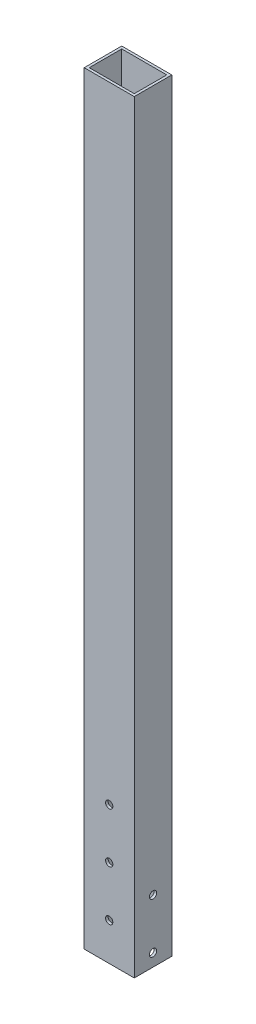
ISO-10303-21;
HEADER;
FILE_DESCRIPTION(('STEP AP214'),'2;1');
FILE_NAME('part.step','',(''),(''),'','','');
FILE_SCHEMA(('AUTOMOTIVE_DESIGN { 1 0 10303 214 1 1 1 1 }'));
ENDSEC;
DATA;
#1=APPLICATION_CONTEXT('core data for automotive mechanical design processes');
#2=APPLICATION_PROTOCOL_DEFINITION('international standard','automotive_design',2000,#1);
#3=PRODUCT_CONTEXT('',#1,'mechanical');
#4=PRODUCT('Part','Part','',(#3));
#5=PRODUCT_RELATED_PRODUCT_CATEGORY('part','',(#4));
#6=PRODUCT_DEFINITION_FORMATION('','',#4);
#7=PRODUCT_DEFINITION_CONTEXT('part definition',#1,'design');
#8=PRODUCT_DEFINITION('design','',#6,#7);
#9=PRODUCT_DEFINITION_SHAPE('','',#8);
#10=(LENGTH_UNIT() NAMED_UNIT(*) SI_UNIT(.MILLI.,.METRE.));
#11=(NAMED_UNIT(*) PLANE_ANGLE_UNIT() SI_UNIT($,.RADIAN.));
#12=(NAMED_UNIT(*) SI_UNIT($,.STERADIAN.) SOLID_ANGLE_UNIT());
#13=UNCERTAINTY_MEASURE_WITH_UNIT(LENGTH_MEASURE(1.E-05),#10,'distance_accuracy_value','');
#14=(GEOMETRIC_REPRESENTATION_CONTEXT(3) GLOBAL_UNCERTAINTY_ASSIGNED_CONTEXT((#13)) GLOBAL_UNIT_ASSIGNED_CONTEXT((#10,
#11,#12)) REPRESENTATION_CONTEXT('',''));
#15=CARTESIAN_POINT('',(0.,0.,0.));
#16=DIRECTION('',(0.,0.,1.));
#17=DIRECTION('',(1.,0.,0.));
#18=AXIS2_PLACEMENT_3D('',#15,#16,#17);
#19=CARTESIAN_POINT('',(0.,305.,0.));
#20=DIRECTION('',(0.,1.,0.));
#21=DIRECTION('',(0.,0.,1.));
#22=AXIS2_PLACEMENT_3D('',#19,#20,#21);
#23=PLANE('',#22);
#24=DIRECTION('',(0.,0.,-1.));
#25=VECTOR('',#24,1.);
#26=CARTESIAN_POINT('',(10.,305.,7.5));
#27=LINE('',#26,#25);
#28=CARTESIAN_POINT('',(10.,305.,7.5));
#29=VERTEX_POINT('',#28);
#30=CARTESIAN_POINT('',(10.,305.,-7.5));
#31=VERTEX_POINT('',#30);
#32=EDGE_CURVE('E187',#29,#31,#27,.T.);
#33=ORIENTED_EDGE('',*,*,#32,.T.);
#34=DIRECTION('',(-1.,0.,0.));
#35=VECTOR('',#34,1.);
#36=CARTESIAN_POINT('',(-10.,305.,-7.5));
#37=LINE('',#36,#35);
#38=CARTESIAN_POINT('',(-10.,305.,-7.5));
#39=VERTEX_POINT('',#38);
#40=EDGE_CURVE('E191',#31,#39,#37,.T.);
#41=ORIENTED_EDGE('',*,*,#40,.T.);
#42=DIRECTION('',(0.,0.,1.));
#43=VECTOR('',#42,1.);
#44=CARTESIAN_POINT('',(-10.,305.,7.5));
#45=LINE('',#44,#43);
#46=CARTESIAN_POINT('',(-10.,305.,7.5));
#47=VERTEX_POINT('',#46);
#48=EDGE_CURVE('E195',#39,#47,#45,.T.);
#49=ORIENTED_EDGE('',*,*,#48,.T.);
#50=DIRECTION('',(1.,0.,0.));
#51=VECTOR('',#50,1.);
#52=CARTESIAN_POINT('',(-10.,305.,7.5));
#53=LINE('',#52,#51);
#54=EDGE_CURVE('E198',#47,#29,#53,.T.);
#55=ORIENTED_EDGE('',*,*,#54,.T.);
#56=EDGE_LOOP('',(#33,#41,#49,#55));
#57=FACE_BOUND('',#56,.T.);
#58=DIRECTION('',(-1.,0.,0.));
#59=VECTOR('',#58,1.);
#60=CARTESIAN_POINT('',(0.,305.,-6.5));
#61=LINE('',#60,#59);
#62=CARTESIAN_POINT('',(9.,305.,-6.5));
#63=VERTEX_POINT('',#62);
#64=CARTESIAN_POINT('',(-9.00000000000001,305.,-6.5));
#65=VERTEX_POINT('',#64);
#66=EDGE_CURVE('E146',#63,#65,#61,.T.);
#67=ORIENTED_EDGE('',*,*,#66,.F.);
#68=DIRECTION('',(0.,0.,-1.));
#69=VECTOR('',#68,1.);
#70=CARTESIAN_POINT('',(9.,305.,0.));
#71=LINE('',#70,#69);
#72=CARTESIAN_POINT('',(9.,305.,6.5));
#73=VERTEX_POINT('',#72);
#74=EDGE_CURVE('E137',#73,#63,#71,.T.);
#75=ORIENTED_EDGE('',*,*,#74,.F.);
#76=DIRECTION('',(1.,0.,0.));
#77=VECTOR('',#76,1.);
#78=CARTESIAN_POINT('',(0.,305.,6.5));
#79=LINE('',#78,#77);
#80=CARTESIAN_POINT('',(-9.00000000000001,305.,6.5));
#81=VERTEX_POINT('',#80);
#82=EDGE_CURVE('E163',#81,#73,#79,.T.);
#83=ORIENTED_EDGE('',*,*,#82,.F.);
#84=DIRECTION('',(0.,0.,1.));
#85=VECTOR('',#84,1.);
#86=CARTESIAN_POINT('',(-9.00000000000001,305.,0.));
#87=LINE('',#86,#85);
#88=EDGE_CURVE('E159',#65,#81,#87,.T.);
#89=ORIENTED_EDGE('',*,*,#88,.F.);
#90=EDGE_LOOP('',(#67,#75,#83,#89));
#91=FACE_BOUND('',#90,.T.);
#92=ADVANCED_FACE('F69',(#57,#91),#23,.T.);
#93=CARTESIAN_POINT('',(0.,0.,0.));
#94=DIRECTION('',(0.,1.,0.));
#95=DIRECTION('',(0.,0.,1.));
#96=AXIS2_PLACEMENT_3D('',#93,#94,#95);
#97=PLANE('',#96);
#98=DIRECTION('',(0.,0.,-1.));
#99=VECTOR('',#98,1.);
#100=CARTESIAN_POINT('',(10.,0.,7.5));
#101=LINE('',#100,#99);
#102=CARTESIAN_POINT('',(10.,0.,7.5));
#103=VERTEX_POINT('',#102);
#104=CARTESIAN_POINT('',(10.,0.,-7.5));
#105=VERTEX_POINT('',#104);
#106=EDGE_CURVE('E155',#103,#105,#101,.T.);
#107=ORIENTED_EDGE('',*,*,#106,.F.);
#108=DIRECTION('',(1.,0.,0.));
#109=VECTOR('',#108,1.);
#110=CARTESIAN_POINT('',(-10.,0.,7.5));
#111=LINE('',#110,#109);
#112=CARTESIAN_POINT('',(-10.,0.,7.5));
#113=VERTEX_POINT('',#112);
#114=EDGE_CURVE('E192',#113,#103,#111,.T.);
#115=ORIENTED_EDGE('',*,*,#114,.F.);
#116=DIRECTION('',(0.,0.,1.));
#117=VECTOR('',#116,1.);
#118=CARTESIAN_POINT('',(-10.,0.,7.5));
#119=LINE('',#118,#117);
#120=CARTESIAN_POINT('',(-10.,0.,-7.5));
#121=VERTEX_POINT('',#120);
#122=EDGE_CURVE('E208',#121,#113,#119,.T.);
#123=ORIENTED_EDGE('',*,*,#122,.F.);
#124=DIRECTION('',(-1.,0.,0.));
#125=VECTOR('',#124,1.);
#126=CARTESIAN_POINT('',(-10.,0.,-7.5));
#127=LINE('',#126,#125);
#128=EDGE_CURVE('E205',#105,#121,#127,.T.);
#129=ORIENTED_EDGE('',*,*,#128,.F.);
#130=EDGE_LOOP('',(#107,#115,#123,#129));
#131=FACE_BOUND('',#130,.T.);
#132=DIRECTION('',(0.,0.,-1.));
#133=VECTOR('',#132,1.);
#134=CARTESIAN_POINT('',(9.,0.,0.));
#135=LINE('',#134,#133);
#136=CARTESIAN_POINT('',(9.,0.,6.5));
#137=VERTEX_POINT('',#136);
#138=CARTESIAN_POINT('',(9.,0.,-6.5));
#139=VERTEX_POINT('',#138);
#140=EDGE_CURVE('E95',#137,#139,#135,.T.);
#141=ORIENTED_EDGE('',*,*,#140,.T.);
#142=DIRECTION('',(-1.,0.,0.));
#143=VECTOR('',#142,1.);
#144=CARTESIAN_POINT('',(0.,0.,-6.5));
#145=LINE('',#144,#143);
#146=CARTESIAN_POINT('',(-9.00000000000001,0.,-6.5));
#147=VERTEX_POINT('',#146);
#148=EDGE_CURVE('E153',#139,#147,#145,.T.);
#149=ORIENTED_EDGE('',*,*,#148,.T.);
#150=DIRECTION('',(0.,0.,1.));
#151=VECTOR('',#150,1.);
#152=CARTESIAN_POINT('',(-9.00000000000001,0.,0.));
#153=LINE('',#152,#151);
#154=CARTESIAN_POINT('',(-9.00000000000001,0.,6.5));
#155=VERTEX_POINT('',#154);
#156=EDGE_CURVE('E174',#147,#155,#153,.T.);
#157=ORIENTED_EDGE('',*,*,#156,.T.);
#158=DIRECTION('',(1.,0.,0.));
#159=VECTOR('',#158,1.);
#160=CARTESIAN_POINT('',(0.,0.,6.5));
#161=LINE('',#160,#159);
#162=EDGE_CURVE('E147',#155,#137,#161,.T.);
#163=ORIENTED_EDGE('',*,*,#162,.T.);
#164=EDGE_LOOP('',(#141,#149,#157,#163));
#165=FACE_BOUND('',#164,.T.);
#166=ADVANCED_FACE('F301',(#131,#165),#97,.F.);
#167=CARTESIAN_POINT('',(10.,305.,7.5));
#168=DIRECTION('',(-1.,0.,0.));
#169=DIRECTION('',(0.,0.,1.));
#170=AXIS2_PLACEMENT_3D('',#167,#168,#169);
#171=PLANE('',#170);
#172=CARTESIAN_POINT('',(10.,5.,0.));
#173=DIRECTION('',(1.,0.,0.));
#174=DIRECTION('',(0.,0.,-1.));
#175=AXIS2_PLACEMENT_3D('',#172,#173,#174);
#176=CIRCLE('',#175,1.45);
#177=CARTESIAN_POINT('',(10.,5.,-1.45));
#178=VERTEX_POINT('',#177);
#179=EDGE_CURVE('E264',#178,#178,#176,.T.);
#180=ORIENTED_EDGE('',*,*,#179,.F.);
#181=EDGE_LOOP('',(#180));
#182=FACE_BOUND('',#181,.T.);
#183=CARTESIAN_POINT('',(10.,25.,0.));
#184=DIRECTION('',(1.,0.,0.));
#185=DIRECTION('',(0.,0.,-1.));
#186=AXIS2_PLACEMENT_3D('',#183,#184,#185);
#187=CIRCLE('',#186,1.45);
#188=CARTESIAN_POINT('',(10.,25.,-1.45));
#189=VERTEX_POINT('',#188);
#190=EDGE_CURVE('E268',#189,#189,#187,.T.);
#191=ORIENTED_EDGE('',*,*,#190,.F.);
#192=EDGE_LOOP('',(#191));
#193=FACE_BOUND('',#192,.T.);
#194=ORIENTED_EDGE('',*,*,#106,.T.);
#195=DIRECTION('',(0.,-1.,0.));
#196=VECTOR('',#195,1.);
#197=CARTESIAN_POINT('',(10.,305.,-7.5));
#198=LINE('',#197,#196);
#199=EDGE_CURVE('E12',#31,#105,#198,.T.);
#200=ORIENTED_EDGE('',*,*,#199,.F.);
#201=ORIENTED_EDGE('',*,*,#32,.F.);
#202=DIRECTION('',(0.,-1.,0.));
#203=VECTOR('',#202,1.);
#204=CARTESIAN_POINT('',(10.,305.,7.5));
#205=LINE('',#204,#203);
#206=EDGE_CURVE('E201',#29,#103,#205,.T.);
#207=ORIENTED_EDGE('',*,*,#206,.T.);
#208=EDGE_LOOP('',(#194,#200,#201,#207));
#209=FACE_BOUND('',#208,.T.);
#210=ADVANCED_FACE('F71',(#182,#193,#209),#171,.F.);
#211=CARTESIAN_POINT('',(-10.,305.,-7.5));
#212=DIRECTION('',(0.,0.,1.));
#213=DIRECTION('',(1.,0.,0.));
#214=AXIS2_PLACEMENT_3D('',#211,#212,#213);
#215=PLANE('',#214);
#216=CARTESIAN_POINT('',(0.,15.,-7.5));
#217=DIRECTION('',(0.,0.,-1.));
#218=DIRECTION('',(-1.,0.,0.));
#219=AXIS2_PLACEMENT_3D('',#216,#217,#218);
#220=CIRCLE('',#219,1.45);
#221=CARTESIAN_POINT('',(-1.45,15.,-7.5));
#222=VERTEX_POINT('',#221);
#223=EDGE_CURVE('E382',#222,#222,#220,.T.);
#224=ORIENTED_EDGE('',*,*,#223,.F.);
#225=EDGE_LOOP('',(#224));
#226=FACE_BOUND('',#225,.T.);
#227=CARTESIAN_POINT('',(0.,35.,-7.5));
#228=DIRECTION('',(0.,0.,-1.));
#229=DIRECTION('',(-1.,0.,0.));
#230=AXIS2_PLACEMENT_3D('',#227,#228,#229);
#231=CIRCLE('',#230,1.45);
#232=CARTESIAN_POINT('',(-1.45,35.,-7.5));
#233=VERTEX_POINT('',#232);
#234=EDGE_CURVE('E384',#233,#233,#231,.T.);
#235=ORIENTED_EDGE('',*,*,#234,.F.);
#236=EDGE_LOOP('',(#235));
#237=FACE_BOUND('',#236,.T.);
#238=CARTESIAN_POINT('',(0.,55.,-7.5));
#239=DIRECTION('',(0.,0.,-1.));
#240=DIRECTION('',(-1.,0.,0.));
#241=AXIS2_PLACEMENT_3D('',#238,#239,#240);
#242=CIRCLE('',#241,1.45);
#243=CARTESIAN_POINT('',(-1.45,55.,-7.5));
#244=VERTEX_POINT('',#243);
#245=EDGE_CURVE('E396',#244,#244,#242,.T.);
#246=ORIENTED_EDGE('',*,*,#245,.F.);
#247=EDGE_LOOP('',(#246));
#248=FACE_BOUND('',#247,.T.);
#249=ORIENTED_EDGE('',*,*,#128,.T.);
#250=DIRECTION('',(0.,-1.,0.));
#251=VECTOR('',#250,1.);
#252=CARTESIAN_POINT('',(-10.,305.,-7.5));
#253=LINE('',#252,#251);
#254=EDGE_CURVE('E79',#39,#121,#253,.T.);
#255=ORIENTED_EDGE('',*,*,#254,.F.);
#256=ORIENTED_EDGE('',*,*,#40,.F.);
#257=ORIENTED_EDGE('',*,*,#199,.T.);
#258=EDGE_LOOP('',(#249,#255,#256,#257));
#259=FACE_BOUND('',#258,.T.);
#260=ADVANCED_FACE('F300',(#226,#237,#248,#259),#215,.F.);
#261=CARTESIAN_POINT('',(-10.,305.,7.5));
#262=DIRECTION('',(1.,0.,0.));
#263=DIRECTION('',(0.,0.,-1.));
#264=AXIS2_PLACEMENT_3D('',#261,#262,#263);
#265=PLANE('',#264);
#266=CARTESIAN_POINT('',(-10.,5.,0.));
#267=DIRECTION('',(1.,0.,0.));
#268=DIRECTION('',(0.,0.,-1.));
#269=AXIS2_PLACEMENT_3D('',#266,#267,#268);
#270=CIRCLE('',#269,1.45);
#271=CARTESIAN_POINT('',(-10.,5.,-1.45));
#272=VERTEX_POINT('',#271);
#273=EDGE_CURVE('E228',#272,#272,#270,.T.);
#274=ORIENTED_EDGE('',*,*,#273,.T.);
#275=EDGE_LOOP('',(#274));
#276=FACE_BOUND('',#275,.T.);
#277=CARTESIAN_POINT('',(-10.,25.,0.));
#278=DIRECTION('',(1.,0.,0.));
#279=DIRECTION('',(0.,0.,-1.));
#280=AXIS2_PLACEMENT_3D('',#277,#278,#279);
#281=CIRCLE('',#280,1.45);
#282=CARTESIAN_POINT('',(-10.,25.,-1.45));
#283=VERTEX_POINT('',#282);
#284=EDGE_CURVE('E260',#283,#283,#281,.T.);
#285=ORIENTED_EDGE('',*,*,#284,.T.);
#286=EDGE_LOOP('',(#285));
#287=FACE_BOUND('',#286,.T.);
#288=ORIENTED_EDGE('',*,*,#122,.T.);
#289=DIRECTION('',(0.,-1.,0.));
#290=VECTOR('',#289,1.);
#291=CARTESIAN_POINT('',(-10.,305.,7.5));
#292=LINE('',#291,#290);
#293=EDGE_CURVE('E216',#47,#113,#292,.T.);
#294=ORIENTED_EDGE('',*,*,#293,.F.);
#295=ORIENTED_EDGE('',*,*,#48,.F.);
#296=ORIENTED_EDGE('',*,*,#254,.T.);
#297=EDGE_LOOP('',(#288,#294,#295,#296));
#298=FACE_BOUND('',#297,.T.);
#299=ADVANCED_FACE('F319',(#276,#287,#298),#265,.F.);
#300=CARTESIAN_POINT('',(-10.,305.,7.5));
#301=DIRECTION('',(0.,0.,-1.));
#302=DIRECTION('',(-1.,0.,0.));
#303=AXIS2_PLACEMENT_3D('',#300,#301,#302);
#304=PLANE('',#303);
#305=CARTESIAN_POINT('',(0.,15.,7.5));
#306=DIRECTION('',(0.,0.,-1.));
#307=DIRECTION('',(-1.,0.,0.));
#308=AXIS2_PLACEMENT_3D('',#305,#306,#307);
#309=CIRCLE('',#308,1.45);
#310=CARTESIAN_POINT('',(-1.45,15.,7.5));
#311=VERTEX_POINT('',#310);
#312=EDGE_CURVE('E237',#311,#311,#309,.T.);
#313=ORIENTED_EDGE('',*,*,#312,.T.);
#314=EDGE_LOOP('',(#313));
#315=FACE_BOUND('',#314,.T.);
#316=CARTESIAN_POINT('',(0.,35.,7.5));
#317=DIRECTION('',(0.,0.,-1.));
#318=DIRECTION('',(-1.,0.,0.));
#319=AXIS2_PLACEMENT_3D('',#316,#317,#318);
#320=CIRCLE('',#319,1.45);
#321=CARTESIAN_POINT('',(-1.45,35.,7.5));
#322=VERTEX_POINT('',#321);
#323=EDGE_CURVE('E391',#322,#322,#320,.T.);
#324=ORIENTED_EDGE('',*,*,#323,.T.);
#325=EDGE_LOOP('',(#324));
#326=FACE_BOUND('',#325,.T.);
#327=CARTESIAN_POINT('',(0.,55.,7.5));
#328=DIRECTION('',(0.,0.,-1.));
#329=DIRECTION('',(-1.,0.,0.));
#330=AXIS2_PLACEMENT_3D('',#327,#328,#329);
#331=CIRCLE('',#330,1.45);
#332=CARTESIAN_POINT('',(-1.45,55.,7.5));
#333=VERTEX_POINT('',#332);
#334=EDGE_CURVE('E253',#333,#333,#331,.T.);
#335=ORIENTED_EDGE('',*,*,#334,.T.);
#336=EDGE_LOOP('',(#335));
#337=FACE_BOUND('',#336,.T.);
#338=ORIENTED_EDGE('',*,*,#114,.T.);
#339=ORIENTED_EDGE('',*,*,#206,.F.);
#340=ORIENTED_EDGE('',*,*,#54,.F.);
#341=ORIENTED_EDGE('',*,*,#293,.T.);
#342=EDGE_LOOP('',(#338,#339,#340,#341));
#343=FACE_BOUND('',#342,.T.);
#344=ADVANCED_FACE('F286',(#315,#326,#337,#343),#304,.F.);
#345=CARTESIAN_POINT('',(9.,305.,0.));
#346=DIRECTION('',(-1.,0.,0.));
#347=DIRECTION('',(0.,0.,1.));
#348=AXIS2_PLACEMENT_3D('',#345,#346,#347);
#349=PLANE('',#348);
#350=CARTESIAN_POINT('',(9.,5.,0.));
#351=DIRECTION('',(-1.,0.,0.));
#352=DIRECTION('',(0.,0.,1.));
#353=AXIS2_PLACEMENT_3D('',#350,#351,#352);
#354=CIRCLE('',#353,1.45);
#355=CARTESIAN_POINT('',(9.,5.,1.45));
#356=VERTEX_POINT('',#355);
#357=EDGE_CURVE('E171',#356,#356,#354,.T.);
#358=ORIENTED_EDGE('',*,*,#357,.F.);
#359=EDGE_LOOP('',(#358));
#360=FACE_BOUND('',#359,.T.);
#361=CARTESIAN_POINT('',(9.,25.,0.));
#362=DIRECTION('',(-1.,0.,0.));
#363=DIRECTION('',(0.,0.,1.));
#364=AXIS2_PLACEMENT_3D('',#361,#362,#363);
#365=CIRCLE('',#364,1.45);
#366=CARTESIAN_POINT('',(9.,25.,1.45));
#367=VERTEX_POINT('',#366);
#368=EDGE_CURVE('E227',#367,#367,#365,.T.);
#369=ORIENTED_EDGE('',*,*,#368,.F.);
#370=EDGE_LOOP('',(#369));
#371=FACE_BOUND('',#370,.T.);
#372=ORIENTED_EDGE('',*,*,#140,.F.);
#373=DIRECTION('',(0.,-1.,0.));
#374=VECTOR('',#373,1.);
#375=CARTESIAN_POINT('',(9.,305.,6.5));
#376=LINE('',#375,#374);
#377=EDGE_CURVE('E141',#73,#137,#376,.T.);
#378=ORIENTED_EDGE('',*,*,#377,.F.);
#379=ORIENTED_EDGE('',*,*,#74,.T.);
#380=DIRECTION('',(0.,-1.,0.));
#381=VECTOR('',#380,1.);
#382=CARTESIAN_POINT('',(9.,305.,-6.5));
#383=LINE('',#382,#381);
#384=EDGE_CURVE('E140',#63,#139,#383,.T.);
#385=ORIENTED_EDGE('',*,*,#384,.T.);
#386=EDGE_LOOP('',(#372,#378,#379,#385));
#387=FACE_BOUND('',#386,.T.);
#388=ADVANCED_FACE('F139',(#360,#371,#387),#349,.T.);
#389=CARTESIAN_POINT('',(0.,305.,-6.5));
#390=DIRECTION('',(0.,0.,1.));
#391=DIRECTION('',(1.,0.,0.));
#392=AXIS2_PLACEMENT_3D('',#389,#390,#391);
#393=PLANE('',#392);
#394=CARTESIAN_POINT('',(0.,15.,-6.5));
#395=DIRECTION('',(0.,0.,1.));
#396=DIRECTION('',(1.,0.,0.));
#397=AXIS2_PLACEMENT_3D('',#394,#395,#396);
#398=CIRCLE('',#397,1.45);
#399=CARTESIAN_POINT('',(1.45,15.,-6.5));
#400=VERTEX_POINT('',#399);
#401=EDGE_CURVE('E256',#400,#400,#398,.T.);
#402=ORIENTED_EDGE('',*,*,#401,.F.);
#403=EDGE_LOOP('',(#402));
#404=FACE_BOUND('',#403,.T.);
#405=CARTESIAN_POINT('',(0.,35.,-6.5));
#406=DIRECTION('',(0.,0.,1.));
#407=DIRECTION('',(1.,0.,0.));
#408=AXIS2_PLACEMENT_3D('',#405,#406,#407);
#409=CIRCLE('',#408,1.45);
#410=CARTESIAN_POINT('',(1.45,35.,-6.5));
#411=VERTEX_POINT('',#410);
#412=EDGE_CURVE('E241',#411,#411,#409,.T.);
#413=ORIENTED_EDGE('',*,*,#412,.F.);
#414=EDGE_LOOP('',(#413));
#415=FACE_BOUND('',#414,.T.);
#416=CARTESIAN_POINT('',(0.,55.,-6.5));
#417=DIRECTION('',(0.,0.,1.));
#418=DIRECTION('',(1.,0.,0.));
#419=AXIS2_PLACEMENT_3D('',#416,#417,#418);
#420=CIRCLE('',#419,1.45);
#421=CARTESIAN_POINT('',(1.45,55.,-6.5));
#422=VERTEX_POINT('',#421);
#423=EDGE_CURVE('E236',#422,#422,#420,.T.);
#424=ORIENTED_EDGE('',*,*,#423,.F.);
#425=EDGE_LOOP('',(#424));
#426=FACE_BOUND('',#425,.T.);
#427=ORIENTED_EDGE('',*,*,#148,.F.);
#428=ORIENTED_EDGE('',*,*,#384,.F.);
#429=ORIENTED_EDGE('',*,*,#66,.T.);
#430=DIRECTION('',(0.,-1.,0.));
#431=VECTOR('',#430,1.);
#432=CARTESIAN_POINT('',(-9.00000000000001,305.,-6.5));
#433=LINE('',#432,#431);
#434=EDGE_CURVE('E156',#65,#147,#433,.T.);
#435=ORIENTED_EDGE('',*,*,#434,.T.);
#436=EDGE_LOOP('',(#427,#428,#429,#435));
#437=FACE_BOUND('',#436,.T.);
#438=ADVANCED_FACE('F150',(#404,#415,#426,#437),#393,.T.);
#439=CARTESIAN_POINT('',(-9.00000000000001,305.,0.));
#440=DIRECTION('',(1.,0.,0.));
#441=DIRECTION('',(0.,0.,-1.));
#442=AXIS2_PLACEMENT_3D('',#439,#440,#441);
#443=PLANE('',#442);
#444=CARTESIAN_POINT('',(-9.00000000000001,5.,0.));
#445=DIRECTION('',(1.,0.,0.));
#446=DIRECTION('',(0.,0.,-1.));
#447=AXIS2_PLACEMENT_3D('',#444,#445,#446);
#448=CIRCLE('',#447,1.45);
#449=CARTESIAN_POINT('',(-9.00000000000001,5.,-1.45));
#450=VERTEX_POINT('',#449);
#451=EDGE_CURVE('E229',#450,#450,#448,.T.);
#452=ORIENTED_EDGE('',*,*,#451,.F.);
#453=EDGE_LOOP('',(#452));
#454=FACE_BOUND('',#453,.T.);
#455=CARTESIAN_POINT('',(-9.00000000000001,25.,0.));
#456=DIRECTION('',(1.,0.,0.));
#457=DIRECTION('',(0.,0.,-1.));
#458=AXIS2_PLACEMENT_3D('',#455,#456,#457);
#459=CIRCLE('',#458,1.45);
#460=CARTESIAN_POINT('',(-9.00000000000001,25.,-1.45));
#461=VERTEX_POINT('',#460);
#462=EDGE_CURVE('E223',#461,#461,#459,.T.);
#463=ORIENTED_EDGE('',*,*,#462,.F.);
#464=EDGE_LOOP('',(#463));
#465=FACE_BOUND('',#464,.T.);
#466=ORIENTED_EDGE('',*,*,#156,.F.);
#467=ORIENTED_EDGE('',*,*,#434,.F.);
#468=ORIENTED_EDGE('',*,*,#88,.T.);
#469=DIRECTION('',(0.,-1.,0.));
#470=VECTOR('',#469,1.);
#471=CARTESIAN_POINT('',(-9.00000000000001,305.,6.5));
#472=LINE('',#471,#470);
#473=EDGE_CURVE('E87',#81,#155,#472,.T.);
#474=ORIENTED_EDGE('',*,*,#473,.T.);
#475=EDGE_LOOP('',(#466,#467,#468,#474));
#476=FACE_BOUND('',#475,.T.);
#477=ADVANCED_FACE('F340',(#454,#465,#476),#443,.T.);
#478=CARTESIAN_POINT('',(0.,305.,6.5));
#479=DIRECTION('',(0.,0.,-1.));
#480=DIRECTION('',(-1.,0.,0.));
#481=AXIS2_PLACEMENT_3D('',#478,#479,#480);
#482=PLANE('',#481);
#483=CARTESIAN_POINT('',(0.,15.,6.5));
#484=DIRECTION('',(0.,0.,-1.));
#485=DIRECTION('',(-1.,0.,0.));
#486=AXIS2_PLACEMENT_3D('',#483,#484,#485);
#487=CIRCLE('',#486,1.45);
#488=CARTESIAN_POINT('',(-1.45,15.,6.5));
#489=VERTEX_POINT('',#488);
#490=EDGE_CURVE('E73',#489,#489,#487,.T.);
#491=ORIENTED_EDGE('',*,*,#490,.F.);
#492=EDGE_LOOP('',(#491));
#493=FACE_BOUND('',#492,.T.);
#494=CARTESIAN_POINT('',(0.,35.,6.5));
#495=DIRECTION('',(0.,0.,-1.));
#496=DIRECTION('',(-1.,0.,0.));
#497=AXIS2_PLACEMENT_3D('',#494,#495,#496);
#498=CIRCLE('',#497,1.45);
#499=CARTESIAN_POINT('',(-1.45,35.,6.5));
#500=VERTEX_POINT('',#499);
#501=EDGE_CURVE('E238',#500,#500,#498,.T.);
#502=ORIENTED_EDGE('',*,*,#501,.F.);
#503=EDGE_LOOP('',(#502));
#504=FACE_BOUND('',#503,.T.);
#505=CARTESIAN_POINT('',(0.,55.,6.5));
#506=DIRECTION('',(0.,0.,-1.));
#507=DIRECTION('',(-1.,0.,0.));
#508=AXIS2_PLACEMENT_3D('',#505,#506,#507);
#509=CIRCLE('',#508,1.45);
#510=CARTESIAN_POINT('',(-1.45,55.,6.5));
#511=VERTEX_POINT('',#510);
#512=EDGE_CURVE('E233',#511,#511,#509,.T.);
#513=ORIENTED_EDGE('',*,*,#512,.F.);
#514=EDGE_LOOP('',(#513));
#515=FACE_BOUND('',#514,.T.);
#516=ORIENTED_EDGE('',*,*,#162,.F.);
#517=ORIENTED_EDGE('',*,*,#473,.F.);
#518=ORIENTED_EDGE('',*,*,#82,.T.);
#519=ORIENTED_EDGE('',*,*,#377,.T.);
#520=EDGE_LOOP('',(#516,#517,#518,#519));
#521=FACE_BOUND('',#520,.T.);
#522=ADVANCED_FACE('F344',(#493,#504,#515,#521),#482,.T.);
#523=CARTESIAN_POINT('',(-10.,25.,0.));
#524=DIRECTION('',(1.,0.,0.));
#525=DIRECTION('',(0.,0.,-1.));
#526=AXIS2_PLACEMENT_3D('',#523,#524,#525);
#527=CYLINDRICAL_SURFACE('',#526,1.45);
#528=ORIENTED_EDGE('',*,*,#462,.T.);
#529=EDGE_LOOP('',(#528));
#530=FACE_BOUND('',#529,.T.);
#531=ORIENTED_EDGE('',*,*,#284,.F.);
#532=EDGE_LOOP('',(#531));
#533=FACE_BOUND('',#532,.T.);
#534=ADVANCED_FACE('F295',(#530,#533),#527,.F.);
#535=CARTESIAN_POINT('',(-10.,5.,0.));
#536=DIRECTION('',(1.,0.,0.));
#537=DIRECTION('',(0.,0.,-1.));
#538=AXIS2_PLACEMENT_3D('',#535,#536,#537);
#539=CYLINDRICAL_SURFACE('',#538,1.45);
#540=ORIENTED_EDGE('',*,*,#451,.T.);
#541=EDGE_LOOP('',(#540));
#542=FACE_BOUND('',#541,.T.);
#543=ORIENTED_EDGE('',*,*,#273,.F.);
#544=EDGE_LOOP('',(#543));
#545=FACE_BOUND('',#544,.T.);
#546=ADVANCED_FACE('F293',(#542,#545),#539,.F.);
#547=ORIENTED_EDGE('',*,*,#368,.T.);
#548=EDGE_LOOP('',(#547));
#549=FACE_BOUND('',#548,.T.);
#550=ORIENTED_EDGE('',*,*,#190,.T.);
#551=EDGE_LOOP('',(#550));
#552=FACE_BOUND('',#551,.T.);
#553=ADVANCED_FACE('F290',(#549,#552),#527,.F.);
#554=ORIENTED_EDGE('',*,*,#357,.T.);
#555=EDGE_LOOP('',(#554));
#556=FACE_BOUND('',#555,.T.);
#557=ORIENTED_EDGE('',*,*,#179,.T.);
#558=EDGE_LOOP('',(#557));
#559=FACE_BOUND('',#558,.T.);
#560=ADVANCED_FACE('F281',(#556,#559),#539,.F.);
#561=CARTESIAN_POINT('',(0.,55.,7.5));
#562=DIRECTION('',(0.,0.,-1.));
#563=DIRECTION('',(-1.,0.,0.));
#564=AXIS2_PLACEMENT_3D('',#561,#562,#563);
#565=CYLINDRICAL_SURFACE('',#564,1.45);
#566=ORIENTED_EDGE('',*,*,#512,.T.);
#567=EDGE_LOOP('',(#566));
#568=FACE_BOUND('',#567,.T.);
#569=ORIENTED_EDGE('',*,*,#334,.F.);
#570=EDGE_LOOP('',(#569));
#571=FACE_BOUND('',#570,.T.);
#572=ADVANCED_FACE('F354',(#568,#571),#565,.F.);
#573=CARTESIAN_POINT('',(0.,35.,7.5));
#574=DIRECTION('',(0.,0.,-1.));
#575=DIRECTION('',(-1.,0.,0.));
#576=AXIS2_PLACEMENT_3D('',#573,#574,#575);
#577=CYLINDRICAL_SURFACE('',#576,1.45);
#578=ORIENTED_EDGE('',*,*,#501,.T.);
#579=EDGE_LOOP('',(#578));
#580=FACE_BOUND('',#579,.T.);
#581=ORIENTED_EDGE('',*,*,#323,.F.);
#582=EDGE_LOOP('',(#581));
#583=FACE_BOUND('',#582,.T.);
#584=ADVANCED_FACE('F357',(#580,#583),#577,.F.);
#585=CARTESIAN_POINT('',(0.,15.,7.5));
#586=DIRECTION('',(0.,0.,-1.));
#587=DIRECTION('',(-1.,0.,0.));
#588=AXIS2_PLACEMENT_3D('',#585,#586,#587);
#589=CYLINDRICAL_SURFACE('',#588,1.45);
#590=ORIENTED_EDGE('',*,*,#490,.T.);
#591=EDGE_LOOP('',(#590));
#592=FACE_BOUND('',#591,.T.);
#593=ORIENTED_EDGE('',*,*,#312,.F.);
#594=EDGE_LOOP('',(#593));
#595=FACE_BOUND('',#594,.T.);
#596=ADVANCED_FACE('F362',(#592,#595),#589,.F.);
#597=ORIENTED_EDGE('',*,*,#423,.T.);
#598=EDGE_LOOP('',(#597));
#599=FACE_BOUND('',#598,.T.);
#600=ORIENTED_EDGE('',*,*,#245,.T.);
#601=EDGE_LOOP('',(#600));
#602=FACE_BOUND('',#601,.T.);
#603=ADVANCED_FACE('F359',(#599,#602),#565,.F.);
#604=ORIENTED_EDGE('',*,*,#412,.T.);
#605=EDGE_LOOP('',(#604));
#606=FACE_BOUND('',#605,.T.);
#607=ORIENTED_EDGE('',*,*,#234,.T.);
#608=EDGE_LOOP('',(#607));
#609=FACE_BOUND('',#608,.T.);
#610=ADVANCED_FACE('F363',(#606,#609),#577,.F.);
#611=ORIENTED_EDGE('',*,*,#401,.T.);
#612=EDGE_LOOP('',(#611));
#613=FACE_BOUND('',#612,.T.);
#614=ORIENTED_EDGE('',*,*,#223,.T.);
#615=EDGE_LOOP('',(#614));
#616=FACE_BOUND('',#615,.T.);
#617=ADVANCED_FACE('F366',(#613,#616),#589,.F.);
#618=CLOSED_SHELL('',(#92,#166,#210,#260,#299,#344,#388,#438,#477,#522,#534,#546,#553,#560,#572,
#584,#596,#603,#610,#617));
#619=MANIFOLD_SOLID_BREP('B2',#618);
#620=ADVANCED_BREP_SHAPE_REPRESENTATION('',(#18,#619),#14);
#621=SHAPE_DEFINITION_REPRESENTATION(#9,#620);
ENDSEC;
END-ISO-10303-21;
